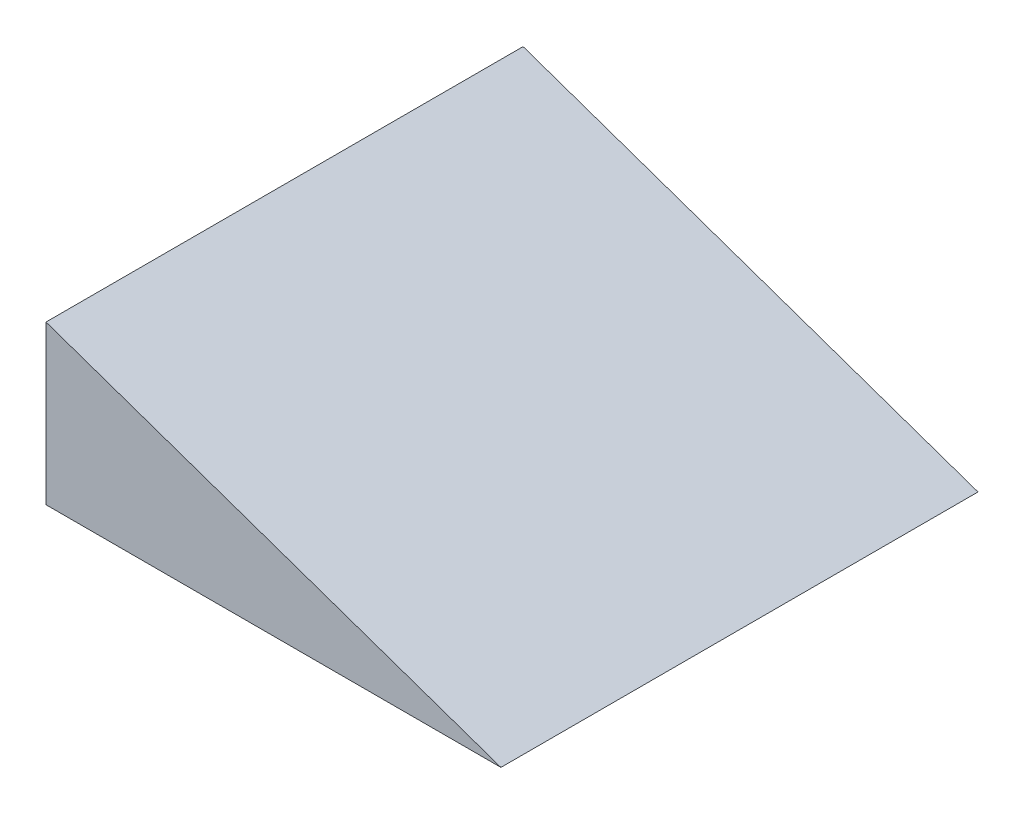
ISO-10303-21;
HEADER;
FILE_DESCRIPTION(('STEP AP214'),'2;1');
FILE_NAME('part.step','',(''),(''),'','','');
FILE_SCHEMA(('AUTOMOTIVE_DESIGN { 1 0 10303 214 1 1 1 1 }'));
ENDSEC;
DATA;
#1=APPLICATION_CONTEXT('core data for automotive mechanical design processes');
#2=APPLICATION_PROTOCOL_DEFINITION('international standard','automotive_design',2000,#1);
#3=PRODUCT_CONTEXT('',#1,'mechanical');
#4=PRODUCT('Part','Part','',(#3));
#5=PRODUCT_RELATED_PRODUCT_CATEGORY('part','',(#4));
#6=PRODUCT_DEFINITION_FORMATION('','',#4);
#7=PRODUCT_DEFINITION_CONTEXT('part definition',#1,'design');
#8=PRODUCT_DEFINITION('design','',#6,#7);
#9=PRODUCT_DEFINITION_SHAPE('','',#8);
#10=(LENGTH_UNIT() NAMED_UNIT(*) SI_UNIT(.MILLI.,.METRE.));
#11=(NAMED_UNIT(*) PLANE_ANGLE_UNIT() SI_UNIT($,.RADIAN.));
#12=(NAMED_UNIT(*) SI_UNIT($,.STERADIAN.) SOLID_ANGLE_UNIT());
#13=UNCERTAINTY_MEASURE_WITH_UNIT(LENGTH_MEASURE(1.E-05),#10,'distance_accuracy_value','');
#14=(GEOMETRIC_REPRESENTATION_CONTEXT(3) GLOBAL_UNCERTAINTY_ASSIGNED_CONTEXT((#13)) GLOBAL_UNIT_ASSIGNED_CONTEXT((#10,
#11,#12)) REPRESENTATION_CONTEXT('',''));
#15=CARTESIAN_POINT('',(0.,0.,0.));
#16=DIRECTION('',(0.,0.,1.));
#17=DIRECTION('',(1.,0.,0.));
#18=AXIS2_PLACEMENT_3D('',#15,#16,#17);
#19=CARTESIAN_POINT('',(0.,8.,24.12));
#20=DIRECTION('',(1.,0.,0.));
#21=DIRECTION('',(0.,0.,-1.));
#22=AXIS2_PLACEMENT_3D('',#19,#20,#21);
#23=PLANE('',#22);
#24=DIRECTION('',(0.,-1.,0.));
#25=VECTOR('',#24,1.);
#26=CARTESIAN_POINT('',(0.,8.,0.));
#27=LINE('',#26,#25);
#28=CARTESIAN_POINT('',(0.,8.,0.));
#29=VERTEX_POINT('',#28);
#30=CARTESIAN_POINT('',(0.,0.,0.));
#31=VERTEX_POINT('',#30);
#32=EDGE_CURVE('E79',#29,#31,#27,.T.);
#33=ORIENTED_EDGE('',*,*,#32,.T.);
#34=DIRECTION('',(0.,0.,-1.));
#35=VECTOR('',#34,1.);
#36=CARTESIAN_POINT('',(0.,0.,24.12));
#37=LINE('',#36,#35);
#38=CARTESIAN_POINT('',(0.,0.,24.12));
#39=VERTEX_POINT('',#38);
#40=EDGE_CURVE('E11',#39,#31,#37,.T.);
#41=ORIENTED_EDGE('',*,*,#40,.F.);
#42=DIRECTION('',(0.,-1.,0.));
#43=VECTOR('',#42,1.);
#44=CARTESIAN_POINT('',(0.,8.,24.12));
#45=LINE('',#44,#43);
#46=CARTESIAN_POINT('',(0.,8.,24.12));
#47=VERTEX_POINT('',#46);
#48=EDGE_CURVE('E72',#47,#39,#45,.T.);
#49=ORIENTED_EDGE('',*,*,#48,.F.);
#50=DIRECTION('',(0.,0.,-1.));
#51=VECTOR('',#50,1.);
#52=CARTESIAN_POINT('',(0.,8.,24.12));
#53=LINE('',#52,#51);
#54=EDGE_CURVE('E80',#47,#29,#53,.T.);
#55=ORIENTED_EDGE('',*,*,#54,.T.);
#56=EDGE_LOOP('',(#33,#41,#49,#55));
#57=FACE_BOUND('',#56,.T.);
#58=ADVANCED_FACE('F32',(#57),#23,.F.);
#59=CARTESIAN_POINT('',(0.,0.,24.12));
#60=DIRECTION('',(0.,1.,0.));
#61=DIRECTION('',(0.,0.,1.));
#62=AXIS2_PLACEMENT_3D('',#59,#60,#61);
#63=PLANE('',#62);
#64=DIRECTION('',(1.,0.,0.));
#65=VECTOR('',#64,1.);
#66=CARTESIAN_POINT('',(0.,0.,0.));
#67=LINE('',#66,#65);
#68=CARTESIAN_POINT('',(23.,0.,0.));
#69=VERTEX_POINT('',#68);
#70=EDGE_CURVE('E60',#31,#69,#67,.T.);
#71=ORIENTED_EDGE('',*,*,#70,.T.);
#72=DIRECTION('',(0.,0.,-1.));
#73=VECTOR('',#72,1.);
#74=CARTESIAN_POINT('',(23.,0.,24.12));
#75=LINE('',#74,#73);
#76=CARTESIAN_POINT('',(23.,0.,24.12));
#77=VERTEX_POINT('',#76);
#78=EDGE_CURVE('E40',#77,#69,#75,.T.);
#79=ORIENTED_EDGE('',*,*,#78,.F.);
#80=DIRECTION('',(1.,0.,0.));
#81=VECTOR('',#80,1.);
#82=CARTESIAN_POINT('',(0.,0.,24.12));
#83=LINE('',#82,#81);
#84=EDGE_CURVE('E68',#39,#77,#83,.T.);
#85=ORIENTED_EDGE('',*,*,#84,.F.);
#86=ORIENTED_EDGE('',*,*,#40,.T.);
#87=EDGE_LOOP('',(#71,#79,#85,#86));
#88=FACE_BOUND('',#87,.T.);
#89=ADVANCED_FACE('F69',(#88),#63,.F.);
#90=CARTESIAN_POINT('',(23.,0.,24.12));
#91=DIRECTION('',(-0.328520624941273,-0.944496796706159,0.));
#92=DIRECTION('',(0.944496796706159,-0.328520624941273,0.));
#93=AXIS2_PLACEMENT_3D('',#90,#91,#92);
#94=PLANE('',#93);
#95=DIRECTION('',(-0.944496796706159,0.328520624941273,0.));
#96=VECTOR('',#95,1.);
#97=CARTESIAN_POINT('',(23.,0.,0.));
#98=LINE('',#97,#96);
#99=EDGE_CURVE('E65',#69,#29,#98,.T.);
#100=ORIENTED_EDGE('',*,*,#99,.T.);
#101=ORIENTED_EDGE('',*,*,#54,.F.);
#102=DIRECTION('',(-0.944496796706159,0.328520624941273,0.));
#103=VECTOR('',#102,1.);
#104=CARTESIAN_POINT('',(23.,0.,24.12));
#105=LINE('',#104,#103);
#106=EDGE_CURVE('E48',#77,#47,#105,.T.);
#107=ORIENTED_EDGE('',*,*,#106,.F.);
#108=ORIENTED_EDGE('',*,*,#78,.T.);
#109=EDGE_LOOP('',(#100,#101,#107,#108));
#110=FACE_BOUND('',#109,.T.);
#111=ADVANCED_FACE('F87',(#110),#94,.F.);
#112=CARTESIAN_POINT('',(0.,0.,24.12));
#113=DIRECTION('',(0.,0.,1.));
#114=DIRECTION('',(1.,0.,0.));
#115=AXIS2_PLACEMENT_3D('',#112,#113,#114);
#116=PLANE('',#115);
#117=ORIENTED_EDGE('',*,*,#48,.T.);
#118=ORIENTED_EDGE('',*,*,#84,.T.);
#119=ORIENTED_EDGE('',*,*,#106,.T.);
#120=EDGE_LOOP('',(#117,#118,#119));
#121=FACE_BOUND('',#120,.T.);
#122=ADVANCED_FACE('F75',(#121),#116,.T.);
#123=CARTESIAN_POINT('',(0.,0.,0.));
#124=DIRECTION('',(0.,0.,1.));
#125=DIRECTION('',(1.,0.,0.));
#126=AXIS2_PLACEMENT_3D('',#123,#124,#125);
#127=PLANE('',#126);
#128=ORIENTED_EDGE('',*,*,#32,.F.);
#129=ORIENTED_EDGE('',*,*,#99,.F.);
#130=ORIENTED_EDGE('',*,*,#70,.F.);
#131=EDGE_LOOP('',(#128,#129,#130));
#132=FACE_BOUND('',#131,.T.);
#133=ADVANCED_FACE('F88',(#132),#127,.F.);
#134=CLOSED_SHELL('',(#58,#89,#111,#122,#133));
#135=MANIFOLD_SOLID_BREP('B2',#134);
#136=ADVANCED_BREP_SHAPE_REPRESENTATION('',(#18,#135),#14);
#137=SHAPE_DEFINITION_REPRESENTATION(#9,#136);
ENDSEC;
END-ISO-10303-21;
